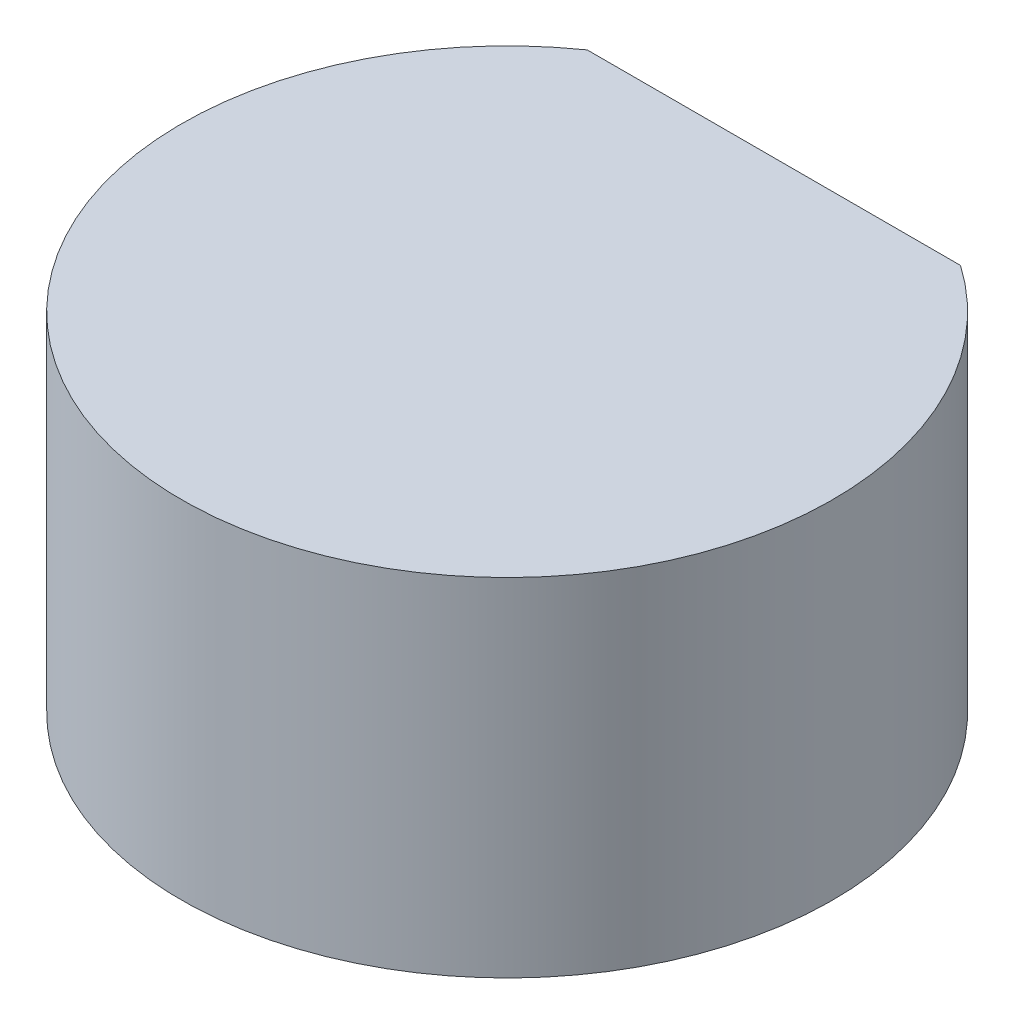
ISO-10303-21;
HEADER;
FILE_DESCRIPTION(('STEP AP214'),'2;1');
FILE_NAME('part.step','',(''),(''),'','','');
FILE_SCHEMA(('AUTOMOTIVE_DESIGN { 1 0 10303 214 1 1 1 1 }'));
ENDSEC;
DATA;
#1=APPLICATION_CONTEXT('core data for automotive mechanical design processes');
#2=APPLICATION_PROTOCOL_DEFINITION('international standard','automotive_design',2000,#1);
#3=PRODUCT_CONTEXT('',#1,'mechanical');
#4=PRODUCT('Part','Part','',(#3));
#5=PRODUCT_RELATED_PRODUCT_CATEGORY('part','',(#4));
#6=PRODUCT_DEFINITION_FORMATION('','',#4);
#7=PRODUCT_DEFINITION_CONTEXT('part definition',#1,'design');
#8=PRODUCT_DEFINITION('design','',#6,#7);
#9=PRODUCT_DEFINITION_SHAPE('','',#8);
#10=(LENGTH_UNIT() NAMED_UNIT(*) SI_UNIT(.MILLI.,.METRE.));
#11=(NAMED_UNIT(*) PLANE_ANGLE_UNIT() SI_UNIT($,.RADIAN.));
#12=(NAMED_UNIT(*) SI_UNIT($,.STERADIAN.) SOLID_ANGLE_UNIT());
#13=UNCERTAINTY_MEASURE_WITH_UNIT(LENGTH_MEASURE(1.E-05),#10,'distance_accuracy_value','');
#14=(GEOMETRIC_REPRESENTATION_CONTEXT(3) GLOBAL_UNCERTAINTY_ASSIGNED_CONTEXT((#13)) GLOBAL_UNIT_ASSIGNED_CONTEXT((#10,
#11,#12)) REPRESENTATION_CONTEXT('',''));
#15=CARTESIAN_POINT('',(0.,0.,0.));
#16=DIRECTION('',(0.,0.,1.));
#17=DIRECTION('',(1.,0.,0.));
#18=AXIS2_PLACEMENT_3D('',#15,#16,#17);
#19=CARTESIAN_POINT('',(-44.4297197830461,82.55,-63.5));
#20=DIRECTION('',(0.,0.,1.));
#21=DIRECTION('',(1.,0.,0.));
#22=AXIS2_PLACEMENT_3D('',#19,#20,#21);
#23=PLANE('',#22);
#24=DIRECTION('',(-1.,0.,0.));
#25=VECTOR('',#24,1.);
#26=CARTESIAN_POINT('',(-44.4297197830461,0.,-63.5));
#27=LINE('',#26,#25);
#28=CARTESIAN_POINT('',(44.4297197830461,0.,-63.5));
#29=VERTEX_POINT('',#28);
#30=CARTESIAN_POINT('',(-44.4297197830461,0.,-63.5));
#31=VERTEX_POINT('',#30);
#32=EDGE_CURVE('E142',#29,#31,#27,.T.);
#33=ORIENTED_EDGE('',*,*,#32,.T.);
#34=DIRECTION('',(0.,-1.,0.));
#35=VECTOR('',#34,1.);
#36=CARTESIAN_POINT('',(-44.4297197830461,82.55,-63.5));
#37=LINE('',#36,#35);
#38=CARTESIAN_POINT('',(-44.4297197830461,82.55,-63.5));
#39=VERTEX_POINT('',#38);
#40=EDGE_CURVE('E42',#39,#31,#37,.T.);
#41=ORIENTED_EDGE('',*,*,#40,.F.);
#42=DIRECTION('',(-1.,0.,0.));
#43=VECTOR('',#42,1.);
#44=CARTESIAN_POINT('',(-44.4297197830461,82.55,-63.5));
#45=LINE('',#44,#43);
#46=CARTESIAN_POINT('',(44.4297197830461,82.55,-63.5));
#47=VERTEX_POINT('',#46);
#48=EDGE_CURVE('E141',#47,#39,#45,.T.);
#49=ORIENTED_EDGE('',*,*,#48,.F.);
#50=DIRECTION('',(0.,-1.,0.));
#51=VECTOR('',#50,1.);
#52=CARTESIAN_POINT('',(44.4297197830461,82.55,-63.5));
#53=LINE('',#52,#51);
#54=EDGE_CURVE('E11',#47,#29,#53,.T.);
#55=ORIENTED_EDGE('',*,*,#54,.T.);
#56=EDGE_LOOP('',(#33,#41,#49,#55));
#57=FACE_BOUND('',#56,.T.);
#58=DIRECTION('',(0.,1.,0.));
#59=VECTOR('',#58,1.);
#60=CARTESIAN_POINT('',(-24.31875,42.5,-63.5));
#61=LINE('',#60,#59);
#62=CARTESIAN_POINT('',(-24.31875,19.,-63.5));
#63=VERTEX_POINT('',#62);
#64=CARTESIAN_POINT('',(-24.31875,42.5,-63.5));
#65=VERTEX_POINT('',#64);
#66=EDGE_CURVE('E107',#63,#65,#61,.T.);
#67=ORIENTED_EDGE('',*,*,#66,.F.);
#68=DIRECTION('',(-1.,0.,0.));
#69=VECTOR('',#68,1.);
#70=CARTESIAN_POINT('',(7.18125,19.,-63.5));
#71=LINE('',#70,#69);
#72=CARTESIAN_POINT('',(7.18125,19.,-63.5));
#73=VERTEX_POINT('',#72);
#74=EDGE_CURVE('E104',#73,#63,#71,.T.);
#75=ORIENTED_EDGE('',*,*,#74,.F.);
#76=DIRECTION('',(0.,-1.,0.));
#77=VECTOR('',#76,1.);
#78=CARTESIAN_POINT('',(7.18125,42.5,-63.5));
#79=LINE('',#78,#77);
#80=CARTESIAN_POINT('',(7.18125,42.5,-63.5));
#81=VERTEX_POINT('',#80);
#82=EDGE_CURVE('E54',#81,#73,#79,.T.);
#83=ORIENTED_EDGE('',*,*,#82,.F.);
#84=DIRECTION('',(1.,0.,0.));
#85=VECTOR('',#84,1.);
#86=CARTESIAN_POINT('',(7.18125,42.5,-63.5));
#87=LINE('',#86,#85);
#88=EDGE_CURVE('E49',#65,#81,#87,.T.);
#89=ORIENTED_EDGE('',*,*,#88,.F.);
#90=EDGE_LOOP('',(#67,#75,#83,#89));
#91=FACE_BOUND('',#90,.T.);
#92=ADVANCED_FACE('F34',(#57,#91),#23,.F.);
#93=CARTESIAN_POINT('',(0.,82.55,0.));
#94=DIRECTION('',(0.,-1.,0.));
#95=DIRECTION('',(0.,0.,-1.));
#96=AXIS2_PLACEMENT_3D('',#93,#94,#95);
#97=CYLINDRICAL_SURFACE('',#96,77.5);
#98=CARTESIAN_POINT('',(0.,0.,0.));
#99=DIRECTION('',(0.,1.,0.));
#100=DIRECTION('',(0.,0.,1.));
#101=AXIS2_PLACEMENT_3D('',#98,#99,#100);
#102=CIRCLE('',#101,77.5);
#103=EDGE_CURVE('E135',#31,#29,#102,.T.);
#104=ORIENTED_EDGE('',*,*,#103,.T.);
#105=ORIENTED_EDGE('',*,*,#54,.F.);
#106=CARTESIAN_POINT('',(0.,82.55,0.));
#107=DIRECTION('',(0.,1.,0.));
#108=DIRECTION('',(0.,0.,1.));
#109=AXIS2_PLACEMENT_3D('',#106,#107,#108);
#110=CIRCLE('',#109,77.5);
#111=EDGE_CURVE('E138',#39,#47,#110,.T.);
#112=ORIENTED_EDGE('',*,*,#111,.F.);
#113=ORIENTED_EDGE('',*,*,#40,.T.);
#114=EDGE_LOOP('',(#104,#105,#112,#113));
#115=FACE_BOUND('',#114,.T.);
#116=ADVANCED_FACE('F36',(#115),#97,.T.);
#117=CARTESIAN_POINT('',(0.,82.55,0.));
#118=DIRECTION('',(0.,1.,0.));
#119=DIRECTION('',(0.,0.,1.));
#120=AXIS2_PLACEMENT_3D('',#117,#118,#119);
#121=PLANE('',#120);
#122=ORIENTED_EDGE('',*,*,#111,.T.);
#123=ORIENTED_EDGE('',*,*,#48,.T.);
#124=EDGE_LOOP('',(#122,#123));
#125=FACE_BOUND('',#124,.T.);
#126=ADVANCED_FACE('F156',(#125),#121,.T.);
#127=CARTESIAN_POINT('',(0.,0.,0.));
#128=DIRECTION('',(0.,1.,0.));
#129=DIRECTION('',(0.,0.,1.));
#130=AXIS2_PLACEMENT_3D('',#127,#128,#129);
#131=PLANE('',#130);
#132=CARTESIAN_POINT('',(27.,0.,-27.5));
#133=DIRECTION('',(0.,-1.,0.));
#134=DIRECTION('',(0.,0.,1.));
#135=AXIS2_PLACEMENT_3D('',#132,#133,#134);
#136=CIRCLE('',#135,2.);
#137=CARTESIAN_POINT('',(27.,0.,-25.5));
#138=VERTEX_POINT('',#137);
#139=EDGE_CURVE('E108',#138,#138,#136,.T.);
#140=ORIENTED_EDGE('',*,*,#139,.F.);
#141=EDGE_LOOP('',(#140));
#142=FACE_BOUND('',#141,.T.);
#143=CARTESIAN_POINT('',(21.,0.,30.5));
#144=DIRECTION('',(0.,-1.,0.));
#145=DIRECTION('',(0.,0.,-1.));
#146=AXIS2_PLACEMENT_3D('',#143,#144,#145);
#147=CIRCLE('',#146,2.);
#148=CARTESIAN_POINT('',(21.,0.,28.5));
#149=VERTEX_POINT('',#148);
#150=EDGE_CURVE('E127',#149,#149,#147,.T.);
#151=ORIENTED_EDGE('',*,*,#150,.F.);
#152=EDGE_LOOP('',(#151));
#153=FACE_BOUND('',#152,.T.);
#154=CARTESIAN_POINT('',(-27.,0.,26.5));
#155=DIRECTION('',(0.,-1.,0.));
#156=DIRECTION('',(0.,0.,-1.));
#157=AXIS2_PLACEMENT_3D('',#154,#155,#156);
#158=CIRCLE('',#157,2.);
#159=CARTESIAN_POINT('',(-27.,0.,24.5));
#160=VERTEX_POINT('',#159);
#161=EDGE_CURVE('E121',#160,#160,#158,.T.);
#162=ORIENTED_EDGE('',*,*,#161,.F.);
#163=EDGE_LOOP('',(#162));
#164=FACE_BOUND('',#163,.T.);
#165=CARTESIAN_POINT('',(-27.,0.,-27.5));
#166=DIRECTION('',(0.,-1.,0.));
#167=DIRECTION('',(0.,0.,-1.));
#168=AXIS2_PLACEMENT_3D('',#165,#166,#167);
#169=CIRCLE('',#168,2.);
#170=CARTESIAN_POINT('',(-27.,0.,-29.5));
#171=VERTEX_POINT('',#170);
#172=EDGE_CURVE('E120',#171,#171,#169,.T.);
#173=ORIENTED_EDGE('',*,*,#172,.F.);
#174=EDGE_LOOP('',(#173));
#175=FACE_BOUND('',#174,.T.);
#176=ORIENTED_EDGE('',*,*,#103,.F.);
#177=ORIENTED_EDGE('',*,*,#32,.F.);
#178=EDGE_LOOP('',(#176,#177));
#179=FACE_BOUND('',#178,.T.);
#180=ADVANCED_FACE('F154',(#142,#153,#164,#175,#179),#131,.F.);
#181=CARTESIAN_POINT('',(-27.,5.,-27.5));
#182=DIRECTION('',(0.,-1.,0.));
#183=DIRECTION('',(0.,0.,-1.));
#184=AXIS2_PLACEMENT_3D('',#181,#182,#183);
#185=CYLINDRICAL_SURFACE('',#184,2.);
#186=CARTESIAN_POINT('',(-27.,5.,-27.5));
#187=DIRECTION('',(0.,-1.,0.));
#188=DIRECTION('',(0.,0.,-1.));
#189=AXIS2_PLACEMENT_3D('',#186,#187,#188);
#190=CIRCLE('',#189,2.);
#191=CARTESIAN_POINT('',(-27.,5.,-29.5));
#192=VERTEX_POINT('',#191);
#193=EDGE_CURVE('E132',#192,#192,#190,.T.);
#194=ORIENTED_EDGE('',*,*,#193,.F.);
#195=EDGE_LOOP('',(#194));
#196=FACE_BOUND('',#195,.T.);
#197=ORIENTED_EDGE('',*,*,#172,.T.);
#198=EDGE_LOOP('',(#197));
#199=FACE_BOUND('',#198,.T.);
#200=ADVANCED_FACE('F163',(#196,#199),#185,.F.);
#201=CARTESIAN_POINT('',(-27.,5.,-27.5));
#202=DIRECTION('',(0.,-1.,0.));
#203=DIRECTION('',(0.,0.,-1.));
#204=AXIS2_PLACEMENT_3D('',#201,#202,#203);
#205=PLANE('',#204);
#206=ORIENTED_EDGE('',*,*,#193,.T.);
#207=EDGE_LOOP('',(#206));
#208=FACE_BOUND('',#207,.T.);
#209=ADVANCED_FACE('F195',(#208),#205,.T.);
#210=CARTESIAN_POINT('',(-27.,5.,26.5));
#211=DIRECTION('',(0.,-1.,0.));
#212=DIRECTION('',(0.,0.,-1.));
#213=AXIS2_PLACEMENT_3D('',#210,#211,#212);
#214=CYLINDRICAL_SURFACE('',#213,2.);
#215=CARTESIAN_POINT('',(-27.,5.,26.5));
#216=DIRECTION('',(0.,-1.,0.));
#217=DIRECTION('',(0.,0.,-1.));
#218=AXIS2_PLACEMENT_3D('',#215,#216,#217);
#219=CIRCLE('',#218,2.);
#220=CARTESIAN_POINT('',(-27.,5.,24.5));
#221=VERTEX_POINT('',#220);
#222=EDGE_CURVE('E117',#221,#221,#219,.T.);
#223=ORIENTED_EDGE('',*,*,#222,.F.);
#224=EDGE_LOOP('',(#223));
#225=FACE_BOUND('',#224,.T.);
#226=ORIENTED_EDGE('',*,*,#161,.T.);
#227=EDGE_LOOP('',(#226));
#228=FACE_BOUND('',#227,.T.);
#229=ADVANCED_FACE('F204',(#225,#228),#214,.F.);
#230=CARTESIAN_POINT('',(-27.,5.,26.5));
#231=DIRECTION('',(0.,-1.,0.));
#232=DIRECTION('',(0.,0.,-1.));
#233=AXIS2_PLACEMENT_3D('',#230,#231,#232);
#234=PLANE('',#233);
#235=ORIENTED_EDGE('',*,*,#222,.T.);
#236=EDGE_LOOP('',(#235));
#237=FACE_BOUND('',#236,.T.);
#238=ADVANCED_FACE('F214',(#237),#234,.T.);
#239=CARTESIAN_POINT('',(21.,5.,30.5));
#240=DIRECTION('',(0.,-1.,0.));
#241=DIRECTION('',(0.,0.,-1.));
#242=AXIS2_PLACEMENT_3D('',#239,#240,#241);
#243=CYLINDRICAL_SURFACE('',#242,2.);
#244=CARTESIAN_POINT('',(21.,5.,30.5));
#245=DIRECTION('',(0.,-1.,0.));
#246=DIRECTION('',(0.,0.,-1.));
#247=AXIS2_PLACEMENT_3D('',#244,#245,#246);
#248=CIRCLE('',#247,2.);
#249=CARTESIAN_POINT('',(21.,5.,28.5));
#250=VERTEX_POINT('',#249);
#251=EDGE_CURVE('E124',#250,#250,#248,.T.);
#252=ORIENTED_EDGE('',*,*,#251,.F.);
#253=EDGE_LOOP('',(#252));
#254=FACE_BOUND('',#253,.T.);
#255=ORIENTED_EDGE('',*,*,#150,.T.);
#256=EDGE_LOOP('',(#255));
#257=FACE_BOUND('',#256,.T.);
#258=ADVANCED_FACE('F224',(#254,#257),#243,.F.);
#259=CARTESIAN_POINT('',(21.,5.,30.5));
#260=DIRECTION('',(0.,-1.,0.));
#261=DIRECTION('',(0.,0.,-1.));
#262=AXIS2_PLACEMENT_3D('',#259,#260,#261);
#263=PLANE('',#262);
#264=ORIENTED_EDGE('',*,*,#251,.T.);
#265=EDGE_LOOP('',(#264));
#266=FACE_BOUND('',#265,.T.);
#267=ADVANCED_FACE('F234',(#266),#263,.T.);
#268=CARTESIAN_POINT('',(27.,5.,-27.5));
#269=DIRECTION('',(0.,-1.,0.));
#270=DIRECTION('',(0.,0.,-1.));
#271=AXIS2_PLACEMENT_3D('',#268,#269,#270);
#272=CYLINDRICAL_SURFACE('',#271,2.);
#273=CARTESIAN_POINT('',(27.,5.,-27.5));
#274=DIRECTION('',(0.,-1.,0.));
#275=DIRECTION('',(0.,0.,1.));
#276=AXIS2_PLACEMENT_3D('',#273,#274,#275);
#277=CIRCLE('',#276,2.);
#278=CARTESIAN_POINT('',(27.,5.,-25.5));
#279=VERTEX_POINT('',#278);
#280=EDGE_CURVE('E111',#279,#279,#277,.T.);
#281=ORIENTED_EDGE('',*,*,#280,.F.);
#282=EDGE_LOOP('',(#281));
#283=FACE_BOUND('',#282,.T.);
#284=ORIENTED_EDGE('',*,*,#139,.T.);
#285=EDGE_LOOP('',(#284));
#286=FACE_BOUND('',#285,.T.);
#287=ADVANCED_FACE('F244',(#283,#286),#272,.F.);
#288=CARTESIAN_POINT('',(27.,5.,-27.5));
#289=DIRECTION('',(0.,1.,0.));
#290=DIRECTION('',(0.,0.,1.));
#291=AXIS2_PLACEMENT_3D('',#288,#289,#290);
#292=PLANE('',#291);
#293=ORIENTED_EDGE('',*,*,#280,.T.);
#294=EDGE_LOOP('',(#293));
#295=FACE_BOUND('',#294,.T.);
#296=ADVANCED_FACE('F253',(#295),#292,.F.);
#297=CARTESIAN_POINT('',(-24.31875,42.5,-78.5));
#298=DIRECTION('',(1.,0.,0.));
#299=DIRECTION('',(0.,0.,-1.));
#300=AXIS2_PLACEMENT_3D('',#297,#298,#299);
#301=PLANE('',#300);
#302=ORIENTED_EDGE('',*,*,#66,.T.);
#303=DIRECTION('',(0.,0.,1.));
#304=VECTOR('',#303,1.);
#305=CARTESIAN_POINT('',(-24.31875,42.5,-78.5));
#306=LINE('',#305,#304);
#307=CARTESIAN_POINT('',(-24.31875,42.5,-78.5));
#308=VERTEX_POINT('',#307);
#309=EDGE_CURVE('E88',#308,#65,#306,.T.);
#310=ORIENTED_EDGE('',*,*,#309,.F.);
#311=DIRECTION('',(0.,1.,0.));
#312=VECTOR('',#311,1.);
#313=CARTESIAN_POINT('',(-24.31875,42.5,-78.5));
#314=LINE('',#313,#312);
#315=CARTESIAN_POINT('',(-24.31875,19.,-78.5));
#316=VERTEX_POINT('',#315);
#317=EDGE_CURVE('E95',#316,#308,#314,.T.);
#318=ORIENTED_EDGE('',*,*,#317,.F.);
#319=DIRECTION('',(0.,0.,1.));
#320=VECTOR('',#319,1.);
#321=CARTESIAN_POINT('',(-24.31875,19.,-78.5));
#322=LINE('',#321,#320);
#323=EDGE_CURVE('E314',#316,#63,#322,.T.);
#324=ORIENTED_EDGE('',*,*,#323,.T.);
#325=EDGE_LOOP('',(#302,#310,#318,#324));
#326=FACE_BOUND('',#325,.T.);
#327=ADVANCED_FACE('F106',(#326),#301,.F.);
#328=CARTESIAN_POINT('',(7.18125,42.5,-78.5));
#329=DIRECTION('',(0.,-1.,0.));
#330=DIRECTION('',(1.,0.,0.));
#331=AXIS2_PLACEMENT_3D('',#328,#329,#330);
#332=PLANE('',#331);
#333=ORIENTED_EDGE('',*,*,#88,.T.);
#334=DIRECTION('',(0.,0.,1.));
#335=VECTOR('',#334,1.);
#336=CARTESIAN_POINT('',(7.18125,42.5,-78.5));
#337=LINE('',#336,#335);
#338=CARTESIAN_POINT('',(7.18125,42.5,-78.5));
#339=VERTEX_POINT('',#338);
#340=EDGE_CURVE('E91',#339,#81,#337,.T.);
#341=ORIENTED_EDGE('',*,*,#340,.F.);
#342=DIRECTION('',(1.,0.,0.));
#343=VECTOR('',#342,1.);
#344=CARTESIAN_POINT('',(7.18125,42.5,-78.5));
#345=LINE('',#344,#343);
#346=EDGE_CURVE('E84',#308,#339,#345,.T.);
#347=ORIENTED_EDGE('',*,*,#346,.F.);
#348=ORIENTED_EDGE('',*,*,#309,.T.);
#349=EDGE_LOOP('',(#333,#341,#347,#348));
#350=FACE_BOUND('',#349,.T.);
#351=ADVANCED_FACE('F86',(#350),#332,.F.);
#352=CARTESIAN_POINT('',(7.18125,42.5,-78.5));
#353=DIRECTION('',(-1.,0.,0.));
#354=DIRECTION('',(0.,-1.,0.));
#355=AXIS2_PLACEMENT_3D('',#352,#353,#354);
#356=PLANE('',#355);
#357=ORIENTED_EDGE('',*,*,#82,.T.);
#358=DIRECTION('',(0.,0.,1.));
#359=VECTOR('',#358,1.);
#360=CARTESIAN_POINT('',(7.18125,19.,-78.5));
#361=LINE('',#360,#359);
#362=CARTESIAN_POINT('',(7.18125,19.,-78.5));
#363=VERTEX_POINT('',#362);
#364=EDGE_CURVE('E113',#363,#73,#361,.T.);
#365=ORIENTED_EDGE('',*,*,#364,.F.);
#366=DIRECTION('',(0.,-1.,0.));
#367=VECTOR('',#366,1.);
#368=CARTESIAN_POINT('',(7.18125,42.5,-78.5));
#369=LINE('',#368,#367);
#370=EDGE_CURVE('E94',#339,#363,#369,.T.);
#371=ORIENTED_EDGE('',*,*,#370,.F.);
#372=ORIENTED_EDGE('',*,*,#340,.T.);
#373=EDGE_LOOP('',(#357,#365,#371,#372));
#374=FACE_BOUND('',#373,.T.);
#375=ADVANCED_FACE('F276',(#374),#356,.F.);
#376=CARTESIAN_POINT('',(7.18125,19.,-78.5));
#377=DIRECTION('',(0.,1.,0.));
#378=DIRECTION('',(0.,0.,1.));
#379=AXIS2_PLACEMENT_3D('',#376,#377,#378);
#380=PLANE('',#379);
#381=ORIENTED_EDGE('',*,*,#74,.T.);
#382=ORIENTED_EDGE('',*,*,#323,.F.);
#383=DIRECTION('',(-1.,0.,0.));
#384=VECTOR('',#383,1.);
#385=CARTESIAN_POINT('',(7.18125,19.,-78.5));
#386=LINE('',#385,#384);
#387=EDGE_CURVE('E100',#363,#316,#386,.T.);
#388=ORIENTED_EDGE('',*,*,#387,.F.);
#389=ORIENTED_EDGE('',*,*,#364,.T.);
#390=EDGE_LOOP('',(#381,#382,#388,#389));
#391=FACE_BOUND('',#390,.T.);
#392=ADVANCED_FACE('F283',(#391),#380,.F.);
#393=CARTESIAN_POINT('',(0.,0.,-78.5));
#394=DIRECTION('',(0.,0.,-1.));
#395=DIRECTION('',(-1.,0.,0.));
#396=AXIS2_PLACEMENT_3D('',#393,#394,#395);
#397=PLANE('',#396);
#398=ORIENTED_EDGE('',*,*,#317,.T.);
#399=ORIENTED_EDGE('',*,*,#346,.T.);
#400=ORIENTED_EDGE('',*,*,#370,.T.);
#401=ORIENTED_EDGE('',*,*,#387,.T.);
#402=EDGE_LOOP('',(#398,#399,#400,#401));
#403=FACE_BOUND('',#402,.T.);
#404=ADVANCED_FACE('F98',(#403),#397,.T.);
#405=CLOSED_SHELL('',(#92,#116,#126,#180,#200,#209,#229,#238,#258,#267,#287,#296,#327,#351,#375,
#392,#404));
#406=MANIFOLD_SOLID_BREP('B2',#405);
#407=ADVANCED_BREP_SHAPE_REPRESENTATION('',(#18,#406),#14);
#408=SHAPE_DEFINITION_REPRESENTATION(#9,#407);
ENDSEC;
END-ISO-10303-21;
